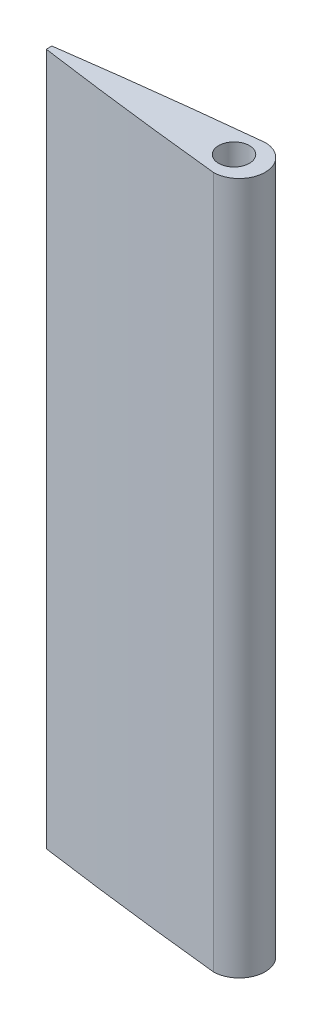
ISO-10303-21;
HEADER;
FILE_DESCRIPTION(('STEP AP214'),'2;1');
FILE_NAME('part.step','',(''),(''),'','','');
FILE_SCHEMA(('AUTOMOTIVE_DESIGN { 1 0 10303 214 1 1 1 1 }'));
ENDSEC;
DATA;
#1=APPLICATION_CONTEXT('core data for automotive mechanical design processes');
#2=APPLICATION_PROTOCOL_DEFINITION('international standard','automotive_design',2000,#1);
#3=PRODUCT_CONTEXT('',#1,'mechanical');
#4=PRODUCT('Part','Part','',(#3));
#5=PRODUCT_RELATED_PRODUCT_CATEGORY('part','',(#4));
#6=PRODUCT_DEFINITION_FORMATION('','',#4);
#7=PRODUCT_DEFINITION_CONTEXT('part definition',#1,'design');
#8=PRODUCT_DEFINITION('design','',#6,#7);
#9=PRODUCT_DEFINITION_SHAPE('','',#8);
#10=(LENGTH_UNIT() NAMED_UNIT(*) SI_UNIT(.MILLI.,.METRE.));
#11=(NAMED_UNIT(*) PLANE_ANGLE_UNIT() SI_UNIT($,.RADIAN.));
#12=(NAMED_UNIT(*) SI_UNIT($,.STERADIAN.) SOLID_ANGLE_UNIT());
#13=UNCERTAINTY_MEASURE_WITH_UNIT(LENGTH_MEASURE(1.E-05),#10,'distance_accuracy_value','');
#14=(GEOMETRIC_REPRESENTATION_CONTEXT(3) GLOBAL_UNCERTAINTY_ASSIGNED_CONTEXT((#13)) GLOBAL_UNIT_ASSIGNED_CONTEXT((#10,
#11,#12)) REPRESENTATION_CONTEXT('',''));
#15=CARTESIAN_POINT('',(0.,0.,0.));
#16=DIRECTION('',(0.,0.,1.));
#17=DIRECTION('',(1.,0.,0.));
#18=AXIS2_PLACEMENT_3D('',#15,#16,#17);
#19=CARTESIAN_POINT('',(-150.337373903682,0.,-85.1304997172093));
#20=DIRECTION('',(0.,-1.,0.));
#21=DIRECTION('',(0.,0.,-1.));
#22=AXIS2_PLACEMENT_3D('',#19,#20,#21);
#23=PLANE('',#22);
#24=CARTESIAN_POINT('',(66.3589324681671,0.,1.26115282415374E-06));
#25=DIRECTION('',(0.,-1.,0.));
#26=DIRECTION('',(0.,0.,-1.));
#27=AXIS2_PLACEMENT_3D('',#24,#25,#26);
#28=CIRCLE('',#27,3.00000000000001);
#29=CARTESIAN_POINT('',(66.3589324681671,0.,-2.99999873884718));
#30=VERTEX_POINT('',#29);
#31=EDGE_CURVE('E204',#30,#30,#28,.T.);
#32=ORIENTED_EDGE('',*,*,#31,.F.);
#33=EDGE_LOOP('',(#32));
#34=FACE_BOUND('',#33,.T.);
#35=CARTESIAN_POINT('',(962401.897402664,0.,-271385.910072042));
#36=CARTESIAN_POINT('',(-965452.773903365,0.,261049.329176301));
#37=CARTESIAN_POINT('',(967902.300908451,0.,-251053.270279428));
#38=B_SPLINE_CURVE_WITH_KNOTS('',2,(#35,#36,#37),.UNSPECIFIED.,.F.,.F.,(3,3),(0.,1.),.UNSPECIFIED.);
#39=CARTESIAN_POINT('',(30.2853099376393,0.,0.514460885104932));
#40=VERTEX_POINT('',#39);
#41=CARTESIAN_POINT('',(67.3584808669425,0.,5.01560846762708));
#42=VERTEX_POINT('',#41);
#43=EDGE_CURVE('E112',#40,#42,#38,.T.);
#44=ORIENTED_EDGE('',*,*,#43,.F.);
#45=DIRECTION('',(2.35782752752043E-07,0.,0.999999999999972));
#46=VECTOR('',#45,1.);
#47=CARTESIAN_POINT('',(30.2853096808674,0.,-0.574558193824209));
#48=LINE('',#47,#46);
#49=CARTESIAN_POINT('',(30.2853096782316,0.,-0.574558193467523));
#50=VERTEX_POINT('',#49);
#51=EDGE_CURVE('E100',#50,#40,#48,.T.);
#52=ORIENTED_EDGE('',*,*,#51,.F.);
#53=CARTESIAN_POINT('',(967902.300911281,0.,251053.210171169));
#54=CARTESIAN_POINT('',(-965452.773906413,0.,-261049.389262358));
#55=CARTESIAN_POINT('',(962401.897405955,0.,271385.849963022));
#56=B_SPLINE_CURVE_WITH_KNOTS('',2,(#53,#54,#55),.UNSPECIFIED.,.F.,.F.,(3,3),(0.,1.),.UNSPECIFIED.);
#57=CARTESIAN_POINT('',(67.3584808669425,0.,-5.07570581239793));
#58=VERTEX_POINT('',#57);
#59=EDGE_CURVE('E105',#58,#50,#56,.T.);
#60=ORIENTED_EDGE('',*,*,#59,.F.);
#61=CARTESIAN_POINT('',(67.3584808669425,0.,-0.0300486723854218));
#62=DIRECTION('',(0.,1.,0.));
#63=DIRECTION('',(0.,0.,1.));
#64=AXIS2_PLACEMENT_3D('',#61,#62,#63);
#65=CIRCLE('',#64,5.0456571400125);
#66=EDGE_CURVE('E109',#42,#58,#65,.T.);
#67=ORIENTED_EDGE('',*,*,#66,.F.);
#68=EDGE_LOOP('',(#44,#52,#60,#67));
#69=FACE_BOUND('',#68,.T.);
#70=ADVANCED_FACE('F69',(#34,#69),#23,.T.);
#71=CARTESIAN_POINT('',(-150.337373903682,135.,-85.1304997172093));
#72=DIRECTION('',(0.,-1.,0.));
#73=DIRECTION('',(0.,0.,-1.));
#74=AXIS2_PLACEMENT_3D('',#71,#72,#73);
#75=PLANE('',#74);
#76=CARTESIAN_POINT('',(66.3585496131861,135.,-0.0183231548622803));
#77=DIRECTION('',(0.,1.,0.));
#78=DIRECTION('',(0.,0.,1.));
#79=AXIS2_PLACEMENT_3D('',#76,#77,#78);
#80=CIRCLE('',#79,3.00000000000001);
#81=CARTESIAN_POINT('',(66.3585496131861,135.,2.98167684513773));
#82=VERTEX_POINT('',#81);
#83=EDGE_CURVE('E194',#82,#82,#80,.T.);
#84=ORIENTED_EDGE('',*,*,#83,.F.);
#85=EDGE_LOOP('',(#84));
#86=FACE_BOUND('',#85,.T.);
#87=CARTESIAN_POINT('',(962401.897402664,135.,-271385.910072042));
#88=CARTESIAN_POINT('',(-965452.773903365,135.,261049.329176301));
#89=CARTESIAN_POINT('',(967902.300908451,135.,-251053.270279428));
#90=B_SPLINE_CURVE_WITH_KNOTS('',2,(#87,#88,#89),.UNSPECIFIED.,.F.,.F.,(3,3),(0.,1.),.UNSPECIFIED.);
#91=CARTESIAN_POINT('',(30.2853099376393,135.,0.514460885104932));
#92=VERTEX_POINT('',#91);
#93=CARTESIAN_POINT('',(67.3584808669425,135.,5.01560846762708));
#94=VERTEX_POINT('',#93);
#95=EDGE_CURVE('E129',#92,#94,#90,.T.);
#96=ORIENTED_EDGE('',*,*,#95,.T.);
#97=CARTESIAN_POINT('',(67.3584808669425,135.,-0.0300486723854218));
#98=DIRECTION('',(0.,1.,0.));
#99=DIRECTION('',(0.,0.,1.));
#100=AXIS2_PLACEMENT_3D('',#97,#98,#99);
#101=CIRCLE('',#100,5.0456571400125);
#102=CARTESIAN_POINT('',(67.3584808669425,135.,-5.07570581239793));
#103=VERTEX_POINT('',#102);
#104=EDGE_CURVE('E89',#94,#103,#101,.T.);
#105=ORIENTED_EDGE('',*,*,#104,.T.);
#106=CARTESIAN_POINT('',(967902.300911281,135.,251053.210171169));
#107=CARTESIAN_POINT('',(-965452.773906413,135.,-261049.389262358));
#108=CARTESIAN_POINT('',(962401.897405955,135.,271385.849963022));
#109=B_SPLINE_CURVE_WITH_KNOTS('',2,(#106,#107,#108),.UNSPECIFIED.,.F.,.F.,(3,3),(0.,1.),.UNSPECIFIED.);
#110=CARTESIAN_POINT('',(30.2853096782316,135.,-0.574558193467523));
#111=VERTEX_POINT('',#110);
#112=EDGE_CURVE('E83',#103,#111,#109,.T.);
#113=ORIENTED_EDGE('',*,*,#112,.T.);
#114=DIRECTION('',(2.35782752752043E-07,0.,0.999999999999972));
#115=VECTOR('',#114,1.);
#116=CARTESIAN_POINT('',(30.2853096808674,135.,-0.574558193824209));
#117=LINE('',#116,#115);
#118=EDGE_CURVE('E12',#111,#92,#117,.T.);
#119=ORIENTED_EDGE('',*,*,#118,.T.);
#120=EDGE_LOOP('',(#96,#105,#113,#119));
#121=FACE_BOUND('',#120,.T.);
#122=ADVANCED_FACE('F173',(#86,#121),#75,.F.);
#123=CARTESIAN_POINT('',(30.2853099376454,0.,0.514460885105317));
#124=CARTESIAN_POINT('',(30.2853099376454,135.,0.514460885105317));
#125=CARTESIAN_POINT('',(47.9658367755805,0.,2.99661640503119));
#126=CARTESIAN_POINT('',(47.9658367755805,135.,2.99661640503119));
#127=CARTESIAN_POINT('',(67.358480866961,0.,5.01560846761833));
#128=CARTESIAN_POINT('',(67.358480866961,135.,5.01560846761833));
#129=B_SPLINE_SURFACE_WITH_KNOTS('',2,1,((#123,#124),(#125,#126),(#127,#128)),.UNSPECIFIED.,.F.,
.F.,.F.,(3,3),(2,2),(0.,1.),(0.,1.),.UNSPECIFIED.);
#130=DIRECTION('',(0.,1.,0.));
#131=VECTOR('',#130,1.);
#132=CARTESIAN_POINT('',(67.3584808669425,0.,5.01560846762708));
#133=LINE('',#132,#131);
#134=EDGE_CURVE('E133',#42,#94,#133,.T.);
#135=DIRECTION('',(0.,1.,0.));
#136=VECTOR('',#135,1.);
#137=CARTESIAN_POINT('',(30.2853099376393,0.,0.514460885104932));
#138=LINE('',#137,#136);
#139=EDGE_CURVE('E124',#40,#92,#138,.T.);
#140=ORIENTED_EDGE('',*,*,#134,.T.);
#141=ORIENTED_EDGE('',*,*,#95,.F.);
#142=ORIENTED_EDGE('',*,*,#139,.F.);
#143=ORIENTED_EDGE('',*,*,#43,.T.);
#144=EDGE_LOOP('',(#140,#141,#142,#143));
#145=FACE_BOUND('',#144,.T.);
#146=ADVANCED_FACE('F128',(#145),#129,.T.);
#147=CARTESIAN_POINT('',(67.3584808669425,0.,-0.0300486723854218));
#148=DIRECTION('',(0.,1.,0.));
#149=DIRECTION('',(0.,0.,1.));
#150=AXIS2_PLACEMENT_3D('',#147,#148,#149);
#151=CYLINDRICAL_SURFACE('',#150,5.0456571400125);
#152=DIRECTION('',(0.,1.,0.));
#153=VECTOR('',#152,1.);
#154=CARTESIAN_POINT('',(67.3584808669425,0.,-5.07570581239793));
#155=LINE('',#154,#153);
#156=EDGE_CURVE('E141',#58,#103,#155,.T.);
#157=ORIENTED_EDGE('',*,*,#156,.T.);
#158=ORIENTED_EDGE('',*,*,#104,.F.);
#159=ORIENTED_EDGE('',*,*,#134,.F.);
#160=ORIENTED_EDGE('',*,*,#66,.T.);
#161=EDGE_LOOP('',(#157,#158,#159,#160));
#162=FACE_BOUND('',#161,.T.);
#163=ADVANCED_FACE('F164',(#162),#151,.T.);
#164=CARTESIAN_POINT('',(67.3584808669387,0.,-5.075705812424));
#165=CARTESIAN_POINT('',(67.3584808669387,135.,-5.075705812424));
#166=CARTESIAN_POINT('',(47.9658366332805,0.,-3.05671373500625));
#167=CARTESIAN_POINT('',(47.9658366332805,135.,-3.05671373500625));
#168=CARTESIAN_POINT('',(30.2853096782392,0.,-0.574558193461859));
#169=CARTESIAN_POINT('',(30.2853096782392,135.,-0.574558193461859));
#170=B_SPLINE_SURFACE_WITH_KNOTS('',2,1,((#164,#165),(#166,#167),(#168,#169)),.UNSPECIFIED.,.F.,
.F.,.F.,(3,3),(2,2),(0.,1.),(0.,1.),.UNSPECIFIED.);
#171=DIRECTION('',(0.,1.,0.));
#172=VECTOR('',#171,1.);
#173=CARTESIAN_POINT('',(30.2853096782316,0.,-0.574558193467523));
#174=LINE('',#173,#172);
#175=EDGE_CURVE('E77',#50,#111,#174,.T.);
#176=ORIENTED_EDGE('',*,*,#175,.T.);
#177=ORIENTED_EDGE('',*,*,#112,.F.);
#178=ORIENTED_EDGE('',*,*,#156,.F.);
#179=ORIENTED_EDGE('',*,*,#59,.T.);
#180=EDGE_LOOP('',(#176,#177,#178,#179));
#181=FACE_BOUND('',#180,.T.);
#182=ADVANCED_FACE('F161',(#181),#170,.T.);
#183=CARTESIAN_POINT('',(30.2853096808674,0.,-0.574558193824209));
#184=DIRECTION('',(-0.999999999999972,0.,2.35782752752043E-07));
#185=DIRECTION('',(2.35782752752043E-07,0.,0.999999999999972));
#186=AXIS2_PLACEMENT_3D('',#183,#184,#185);
#187=PLANE('',#186);
#188=ORIENTED_EDGE('',*,*,#118,.F.);
#189=ORIENTED_EDGE('',*,*,#175,.F.);
#190=ORIENTED_EDGE('',*,*,#51,.T.);
#191=ORIENTED_EDGE('',*,*,#139,.T.);
#192=EDGE_LOOP('',(#188,#189,#190,#191));
#193=FACE_BOUND('',#192,.T.);
#194=ADVANCED_FACE('F123',(#193),#187,.T.);
#195=CARTESIAN_POINT('',(66.3585496131861,130.,-0.0183231548622803));
#196=DIRECTION('',(0.,1.,0.));
#197=DIRECTION('',(0.,0.,1.));
#198=AXIS2_PLACEMENT_3D('',#195,#196,#197);
#199=CYLINDRICAL_SURFACE('',#198,3.00000000000001);
#200=CARTESIAN_POINT('',(66.3585496131861,130.,-0.0183231548622803));
#201=DIRECTION('',(0.,1.,0.));
#202=DIRECTION('',(0.,0.,1.));
#203=AXIS2_PLACEMENT_3D('',#200,#201,#202);
#204=CIRCLE('',#203,3.00000000000001);
#205=CARTESIAN_POINT('',(66.3585496131861,130.,2.98167684513773));
#206=VERTEX_POINT('',#205);
#207=EDGE_CURVE('E118',#206,#206,#204,.T.);
#208=ORIENTED_EDGE('',*,*,#207,.F.);
#209=EDGE_LOOP('',(#208));
#210=FACE_BOUND('',#209,.T.);
#211=ORIENTED_EDGE('',*,*,#83,.T.);
#212=EDGE_LOOP('',(#211));
#213=FACE_BOUND('',#212,.T.);
#214=ADVANCED_FACE('F176',(#210,#213),#199,.F.);
#215=CARTESIAN_POINT('',(66.3585496131861,130.,-0.0183231548622803));
#216=DIRECTION('',(0.,1.,0.));
#217=DIRECTION('',(0.,0.,1.));
#218=AXIS2_PLACEMENT_3D('',#215,#216,#217);
#219=PLANE('',#218);
#220=ORIENTED_EDGE('',*,*,#207,.T.);
#221=EDGE_LOOP('',(#220));
#222=FACE_BOUND('',#221,.T.);
#223=ADVANCED_FACE('F182',(#222),#219,.T.);
#224=CARTESIAN_POINT('',(66.3589324681671,5.,1.26115282415374E-06));
#225=DIRECTION('',(0.,-1.,0.));
#226=DIRECTION('',(0.,0.,-1.));
#227=AXIS2_PLACEMENT_3D('',#224,#225,#226);
#228=CYLINDRICAL_SURFACE('',#227,3.00000000000001);
#229=CARTESIAN_POINT('',(66.3589324681671,5.,1.26115282415374E-06));
#230=DIRECTION('',(0.,-1.,0.));
#231=DIRECTION('',(0.,0.,-1.));
#232=AXIS2_PLACEMENT_3D('',#229,#230,#231);
#233=CIRCLE('',#232,3.00000000000001);
#234=CARTESIAN_POINT('',(66.3589324681671,5.,-2.99999873884718));
#235=VERTEX_POINT('',#234);
#236=EDGE_CURVE('E197',#235,#235,#233,.T.);
#237=ORIENTED_EDGE('',*,*,#236,.F.);
#238=EDGE_LOOP('',(#237));
#239=FACE_BOUND('',#238,.T.);
#240=ORIENTED_EDGE('',*,*,#31,.T.);
#241=EDGE_LOOP('',(#240));
#242=FACE_BOUND('',#241,.T.);
#243=ADVANCED_FACE('F221',(#239,#242),#228,.F.);
#244=CARTESIAN_POINT('',(66.3589324681671,5.,1.26115282415374E-06));
#245=DIRECTION('',(0.,-1.,0.));
#246=DIRECTION('',(0.,0.,-1.));
#247=AXIS2_PLACEMENT_3D('',#244,#245,#246);
#248=PLANE('',#247);
#249=ORIENTED_EDGE('',*,*,#236,.T.);
#250=EDGE_LOOP('',(#249));
#251=FACE_BOUND('',#250,.T.);
#252=ADVANCED_FACE('F223',(#251),#248,.T.);
#253=CLOSED_SHELL('',(#70,#122,#146,#163,#182,#194,#214,#223,#243,#252));
#254=MANIFOLD_SOLID_BREP('B2',#253);
#255=ADVANCED_BREP_SHAPE_REPRESENTATION('',(#18,#254),#14);
#256=SHAPE_DEFINITION_REPRESENTATION(#9,#255);
ENDSEC;
END-ISO-10303-21;
